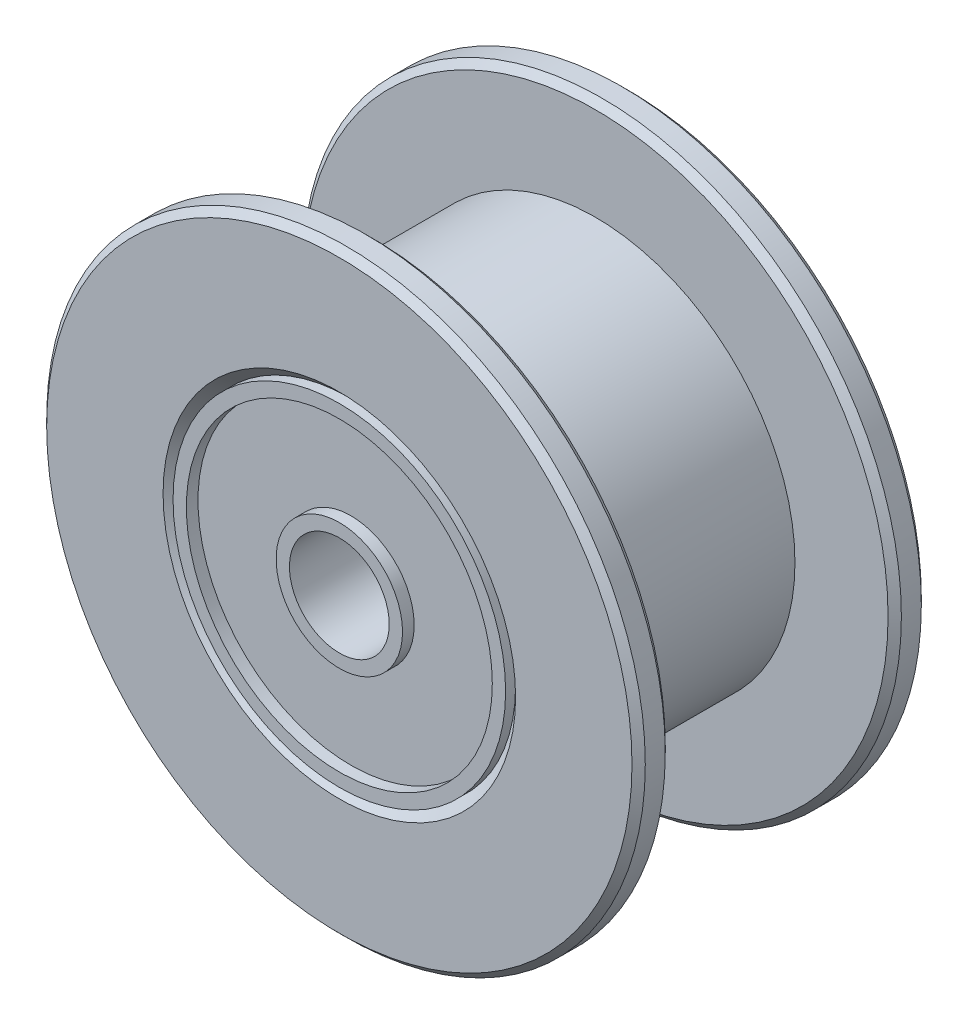
ISO-10303-21;
HEADER;
FILE_DESCRIPTION(('STEP AP214'),'2;1');
FILE_NAME('part.step','',(''),(''),'','','');
FILE_SCHEMA(('AUTOMOTIVE_DESIGN { 1 0 10303 214 1 1 1 1 }'));
ENDSEC;
DATA;
#1=APPLICATION_CONTEXT('core data for automotive mechanical design processes');
#2=APPLICATION_PROTOCOL_DEFINITION('international standard','automotive_design',2000,#1);
#3=PRODUCT_CONTEXT('',#1,'mechanical');
#4=PRODUCT('Part','Part','',(#3));
#5=PRODUCT_RELATED_PRODUCT_CATEGORY('part','',(#4));
#6=PRODUCT_DEFINITION_FORMATION('','',#4);
#7=PRODUCT_DEFINITION_CONTEXT('part definition',#1,'design');
#8=PRODUCT_DEFINITION('design','',#6,#7);
#9=PRODUCT_DEFINITION_SHAPE('','',#8);
#10=(LENGTH_UNIT() NAMED_UNIT(*) SI_UNIT(.MILLI.,.METRE.));
#11=(NAMED_UNIT(*) PLANE_ANGLE_UNIT() SI_UNIT($,.RADIAN.));
#12=(NAMED_UNIT(*) SI_UNIT($,.STERADIAN.) SOLID_ANGLE_UNIT());
#13=UNCERTAINTY_MEASURE_WITH_UNIT(LENGTH_MEASURE(1.E-05),#10,'distance_accuracy_value','');
#14=(GEOMETRIC_REPRESENTATION_CONTEXT(3) GLOBAL_UNCERTAINTY_ASSIGNED_CONTEXT((#13)) GLOBAL_UNIT_ASSIGNED_CONTEXT((#10,
#11,#12)) REPRESENTATION_CONTEXT('',''));
#15=CARTESIAN_POINT('',(0.,0.,0.));
#16=DIRECTION('',(0.,0.,1.));
#17=DIRECTION('',(1.,0.,0.));
#18=AXIS2_PLACEMENT_3D('',#15,#16,#17);
#19=CARTESIAN_POINT('',(5.,0.,-4.35));
#20=DIRECTION('',(0.,0.,-1.));
#21=DIRECTION('',(-1.,0.,0.));
#22=AXIS2_PLACEMENT_3D('',#19,#20,#21);
#23=PLANE('',#22);
#24=CARTESIAN_POINT('',(0.,0.,-4.35));
#25=DIRECTION('',(0.,0.,1.));
#26=DIRECTION('',(1.,0.,0.));
#27=AXIS2_PLACEMENT_3D('',#24,#25,#26);
#28=CIRCLE('',#27,4.6);
#29=CARTESIAN_POINT('',(4.6,0.,-4.35));
#30=VERTEX_POINT('',#29);
#31=EDGE_CURVE('E10',#30,#30,#28,.T.);
#32=ORIENTED_EDGE('',*,*,#31,.T.);
#33=EDGE_LOOP('',(#32));
#34=FACE_BOUND('',#33,.T.);
#35=CARTESIAN_POINT('',(0.,0.,-4.35));
#36=DIRECTION('',(0.,0.,1.));
#37=DIRECTION('',(1.,0.,0.));
#38=AXIS2_PLACEMENT_3D('',#35,#36,#37);
#39=CIRCLE('',#38,5.);
#40=CARTESIAN_POINT('',(5.,0.,-4.35));
#41=VERTEX_POINT('',#40);
#42=EDGE_CURVE('E117',#41,#41,#39,.T.);
#43=ORIENTED_EDGE('',*,*,#42,.F.);
#44=EDGE_LOOP('',(#43));
#45=FACE_BOUND('',#44,.T.);
#46=ADVANCED_FACE('F35',(#34,#45),#23,.T.);
#47=CARTESIAN_POINT('',(0.,0.,-4.35));
#48=DIRECTION('',(0.,0.,1.));
#49=DIRECTION('',(1.,0.,0.));
#50=AXIS2_PLACEMENT_3D('',#47,#48,#49);
#51=CYLINDRICAL_SURFACE('',#50,4.6);
#52=CARTESIAN_POINT('',(0.,0.,-4.));
#53=DIRECTION('',(0.,0.,1.));
#54=DIRECTION('',(1.,0.,0.));
#55=AXIS2_PLACEMENT_3D('',#52,#53,#54);
#56=CIRCLE('',#55,4.6);
#57=CARTESIAN_POINT('',(4.6,0.,-4.));
#58=VERTEX_POINT('',#57);
#59=EDGE_CURVE('E41',#58,#58,#56,.T.);
#60=ORIENTED_EDGE('',*,*,#59,.T.);
#61=EDGE_LOOP('',(#60));
#62=FACE_BOUND('',#61,.T.);
#63=ORIENTED_EDGE('',*,*,#31,.F.);
#64=EDGE_LOOP('',(#63));
#65=FACE_BOUND('',#64,.T.);
#66=ADVANCED_FACE('F125',(#62,#65),#51,.F.);
#67=CARTESIAN_POINT('',(4.6,0.,-4.));
#68=DIRECTION('',(0.,0.,-1.));
#69=DIRECTION('',(-1.,0.,0.));
#70=AXIS2_PLACEMENT_3D('',#67,#68,#69);
#71=PLANE('',#70);
#72=CARTESIAN_POINT('',(0.,0.,-4.));
#73=DIRECTION('',(0.,0.,1.));
#74=DIRECTION('',(1.,0.,0.));
#75=AXIS2_PLACEMENT_3D('',#72,#73,#74);
#76=CIRCLE('',#75,1.9);
#77=CARTESIAN_POINT('',(1.9,0.,-4.));
#78=VERTEX_POINT('',#77);
#79=EDGE_CURVE('E45',#78,#78,#76,.T.);
#80=ORIENTED_EDGE('',*,*,#79,.T.);
#81=EDGE_LOOP('',(#80));
#82=FACE_BOUND('',#81,.T.);
#83=ORIENTED_EDGE('',*,*,#59,.F.);
#84=EDGE_LOOP('',(#83));
#85=FACE_BOUND('',#84,.T.);
#86=ADVANCED_FACE('F129',(#82,#85),#71,.T.);
#87=CARTESIAN_POINT('',(0.,0.,-4.35));
#88=DIRECTION('',(0.,0.,1.));
#89=DIRECTION('',(1.,0.,0.));
#90=AXIS2_PLACEMENT_3D('',#87,#88,#89);
#91=CYLINDRICAL_SURFACE('',#90,1.9);
#92=CARTESIAN_POINT('',(0.,0.,-4.35));
#93=DIRECTION('',(0.,0.,1.));
#94=DIRECTION('',(1.,0.,0.));
#95=AXIS2_PLACEMENT_3D('',#92,#93,#94);
#96=CIRCLE('',#95,1.9);
#97=CARTESIAN_POINT('',(1.9,0.,-4.35));
#98=VERTEX_POINT('',#97);
#99=EDGE_CURVE('E49',#98,#98,#96,.T.);
#100=ORIENTED_EDGE('',*,*,#99,.T.);
#101=EDGE_LOOP('',(#100));
#102=FACE_BOUND('',#101,.T.);
#103=ORIENTED_EDGE('',*,*,#79,.F.);
#104=EDGE_LOOP('',(#103));
#105=FACE_BOUND('',#104,.T.);
#106=ADVANCED_FACE('F133',(#102,#105),#91,.T.);
#107=CARTESIAN_POINT('',(1.9,0.,-4.35));
#108=DIRECTION('',(0.,0.,-1.));
#109=DIRECTION('',(-1.,0.,0.));
#110=AXIS2_PLACEMENT_3D('',#107,#108,#109);
#111=PLANE('',#110);
#112=CARTESIAN_POINT('',(0.,0.,-4.35));
#113=DIRECTION('',(0.,0.,1.));
#114=DIRECTION('',(1.,0.,0.));
#115=AXIS2_PLACEMENT_3D('',#112,#113,#114);
#116=CIRCLE('',#115,1.5);
#117=CARTESIAN_POINT('',(1.5,0.,-4.35));
#118=VERTEX_POINT('',#117);
#119=EDGE_CURVE('E54',#118,#118,#116,.T.);
#120=ORIENTED_EDGE('',*,*,#119,.T.);
#121=EDGE_LOOP('',(#120));
#122=FACE_BOUND('',#121,.T.);
#123=ORIENTED_EDGE('',*,*,#99,.F.);
#124=EDGE_LOOP('',(#123));
#125=FACE_BOUND('',#124,.T.);
#126=ADVANCED_FACE('F140',(#122,#125),#111,.T.);
#127=CARTESIAN_POINT('',(0.,0.,-4.35));
#128=DIRECTION('',(0.,0.,1.));
#129=DIRECTION('',(1.,0.,0.));
#130=AXIS2_PLACEMENT_3D('',#127,#128,#129);
#131=CYLINDRICAL_SURFACE('',#130,1.5);
#132=CARTESIAN_POINT('',(0.,0.,4.35));
#133=DIRECTION('',(0.,0.,1.));
#134=DIRECTION('',(1.,0.,0.));
#135=AXIS2_PLACEMENT_3D('',#132,#133,#134);
#136=CIRCLE('',#135,1.5);
#137=CARTESIAN_POINT('',(1.5,0.,4.35));
#138=VERTEX_POINT('',#137);
#139=EDGE_CURVE('E57',#138,#138,#136,.T.);
#140=ORIENTED_EDGE('',*,*,#139,.T.);
#141=EDGE_LOOP('',(#140));
#142=FACE_BOUND('',#141,.T.);
#143=ORIENTED_EDGE('',*,*,#119,.F.);
#144=EDGE_LOOP('',(#143));
#145=FACE_BOUND('',#144,.T.);
#146=ADVANCED_FACE('F144',(#142,#145),#131,.F.);
#147=CARTESIAN_POINT('',(1.5,0.,4.35));
#148=DIRECTION('',(0.,0.,1.));
#149=DIRECTION('',(1.,0.,0.));
#150=AXIS2_PLACEMENT_3D('',#147,#148,#149);
#151=PLANE('',#150);
#152=CARTESIAN_POINT('',(0.,0.,4.35));
#153=DIRECTION('',(0.,0.,1.));
#154=DIRECTION('',(1.,0.,0.));
#155=AXIS2_PLACEMENT_3D('',#152,#153,#154);
#156=CIRCLE('',#155,1.9);
#157=CARTESIAN_POINT('',(1.9,0.,4.35));
#158=VERTEX_POINT('',#157);
#159=EDGE_CURVE('E60',#158,#158,#156,.T.);
#160=ORIENTED_EDGE('',*,*,#159,.T.);
#161=EDGE_LOOP('',(#160));
#162=FACE_BOUND('',#161,.T.);
#163=ORIENTED_EDGE('',*,*,#139,.F.);
#164=EDGE_LOOP('',(#163));
#165=FACE_BOUND('',#164,.T.);
#166=ADVANCED_FACE('F148',(#162,#165),#151,.T.);
#167=CARTESIAN_POINT('',(0.,0.,-4.35));
#168=DIRECTION('',(0.,0.,1.));
#169=DIRECTION('',(1.,0.,0.));
#170=AXIS2_PLACEMENT_3D('',#167,#168,#169);
#171=CYLINDRICAL_SURFACE('',#170,1.9);
#172=CARTESIAN_POINT('',(0.,0.,4.));
#173=DIRECTION('',(0.,0.,1.));
#174=DIRECTION('',(1.,0.,0.));
#175=AXIS2_PLACEMENT_3D('',#172,#173,#174);
#176=CIRCLE('',#175,1.9);
#177=CARTESIAN_POINT('',(1.9,0.,4.));
#178=VERTEX_POINT('',#177);
#179=EDGE_CURVE('E63',#178,#178,#176,.T.);
#180=ORIENTED_EDGE('',*,*,#179,.T.);
#181=EDGE_LOOP('',(#180));
#182=FACE_BOUND('',#181,.T.);
#183=ORIENTED_EDGE('',*,*,#159,.F.);
#184=EDGE_LOOP('',(#183));
#185=FACE_BOUND('',#184,.T.);
#186=ADVANCED_FACE('F152',(#182,#185),#171,.T.);
#187=CARTESIAN_POINT('',(1.9,0.,4.));
#188=DIRECTION('',(0.,0.,1.));
#189=DIRECTION('',(1.,0.,0.));
#190=AXIS2_PLACEMENT_3D('',#187,#188,#189);
#191=PLANE('',#190);
#192=CARTESIAN_POINT('',(0.,0.,4.));
#193=DIRECTION('',(0.,0.,1.));
#194=DIRECTION('',(1.,0.,0.));
#195=AXIS2_PLACEMENT_3D('',#192,#193,#194);
#196=CIRCLE('',#195,4.6);
#197=CARTESIAN_POINT('',(4.6,0.,4.));
#198=VERTEX_POINT('',#197);
#199=EDGE_CURVE('E66',#198,#198,#196,.T.);
#200=ORIENTED_EDGE('',*,*,#199,.T.);
#201=EDGE_LOOP('',(#200));
#202=FACE_BOUND('',#201,.T.);
#203=ORIENTED_EDGE('',*,*,#179,.F.);
#204=EDGE_LOOP('',(#203));
#205=FACE_BOUND('',#204,.T.);
#206=ADVANCED_FACE('F156',(#202,#205),#191,.T.);
#207=CARTESIAN_POINT('',(0.,0.,-4.35));
#208=DIRECTION('',(0.,0.,1.));
#209=DIRECTION('',(1.,0.,0.));
#210=AXIS2_PLACEMENT_3D('',#207,#208,#209);
#211=CYLINDRICAL_SURFACE('',#210,4.6);
#212=CARTESIAN_POINT('',(0.,0.,4.35));
#213=DIRECTION('',(0.,0.,1.));
#214=DIRECTION('',(1.,0.,0.));
#215=AXIS2_PLACEMENT_3D('',#212,#213,#214);
#216=CIRCLE('',#215,4.6);
#217=CARTESIAN_POINT('',(4.6,0.,4.35));
#218=VERTEX_POINT('',#217);
#219=EDGE_CURVE('E69',#218,#218,#216,.T.);
#220=ORIENTED_EDGE('',*,*,#219,.T.);
#221=EDGE_LOOP('',(#220));
#222=FACE_BOUND('',#221,.T.);
#223=ORIENTED_EDGE('',*,*,#199,.F.);
#224=EDGE_LOOP('',(#223));
#225=FACE_BOUND('',#224,.T.);
#226=ADVANCED_FACE('F160',(#222,#225),#211,.F.);
#227=CARTESIAN_POINT('',(4.6,0.,4.35));
#228=DIRECTION('',(0.,0.,1.));
#229=DIRECTION('',(1.,0.,0.));
#230=AXIS2_PLACEMENT_3D('',#227,#228,#229);
#231=PLANE('',#230);
#232=CARTESIAN_POINT('',(0.,0.,4.35));
#233=DIRECTION('',(0.,0.,1.));
#234=DIRECTION('',(1.,0.,0.));
#235=AXIS2_PLACEMENT_3D('',#232,#233,#234);
#236=CIRCLE('',#235,5.);
#237=CARTESIAN_POINT('',(5.,0.,4.35));
#238=VERTEX_POINT('',#237);
#239=EDGE_CURVE('E72',#238,#238,#236,.T.);
#240=ORIENTED_EDGE('',*,*,#239,.T.);
#241=EDGE_LOOP('',(#240));
#242=FACE_BOUND('',#241,.T.);
#243=ORIENTED_EDGE('',*,*,#219,.F.);
#244=EDGE_LOOP('',(#243));
#245=FACE_BOUND('',#244,.T.);
#246=ADVANCED_FACE('F164',(#242,#245),#231,.T.);
#247=CARTESIAN_POINT('',(0.,0.,-4.35));
#248=DIRECTION('',(0.,0.,1.));
#249=DIRECTION('',(1.,0.,0.));
#250=AXIS2_PLACEMENT_3D('',#247,#248,#249);
#251=CYLINDRICAL_SURFACE('',#250,5.);
#252=CARTESIAN_POINT('',(0.,0.,4.05));
#253=DIRECTION('',(0.,0.,1.));
#254=DIRECTION('',(1.,0.,0.));
#255=AXIS2_PLACEMENT_3D('',#252,#253,#254);
#256=CIRCLE('',#255,5.);
#257=CARTESIAN_POINT('',(5.,0.,4.05));
#258=VERTEX_POINT('',#257);
#259=EDGE_CURVE('E75',#258,#258,#256,.T.);
#260=ORIENTED_EDGE('',*,*,#259,.T.);
#261=EDGE_LOOP('',(#260));
#262=FACE_BOUND('',#261,.T.);
#263=ORIENTED_EDGE('',*,*,#239,.F.);
#264=EDGE_LOOP('',(#263));
#265=FACE_BOUND('',#264,.T.);
#266=ADVANCED_FACE('F168',(#262,#265),#251,.T.);
#267=CARTESIAN_POINT('',(0.,0.,4.05));
#268=DIRECTION('',(0.,0.,1.));
#269=DIRECTION('',(1.,0.,0.));
#270=AXIS2_PLACEMENT_3D('',#267,#268,#269);
#271=CONICAL_SURFACE('',#270,5.,0.785398163397448);
#272=CARTESIAN_POINT('',(0.,0.,4.35));
#273=DIRECTION('',(0.,0.,1.));
#274=DIRECTION('',(1.,0.,0.));
#275=AXIS2_PLACEMENT_3D('',#272,#273,#274);
#276=CIRCLE('',#275,5.3);
#277=CARTESIAN_POINT('',(5.3,0.,4.35));
#278=VERTEX_POINT('',#277);
#279=EDGE_CURVE('E78',#278,#278,#276,.T.);
#280=ORIENTED_EDGE('',*,*,#279,.T.);
#281=EDGE_LOOP('',(#280));
#282=FACE_BOUND('',#281,.T.);
#283=ORIENTED_EDGE('',*,*,#259,.F.);
#284=EDGE_LOOP('',(#283));
#285=FACE_BOUND('',#284,.T.);
#286=ADVANCED_FACE('F172',(#282,#285),#271,.F.);
#287=CARTESIAN_POINT('',(5.3,0.,4.35));
#288=DIRECTION('',(0.,0.,1.));
#289=DIRECTION('',(1.,0.,0.));
#290=AXIS2_PLACEMENT_3D('',#287,#288,#289);
#291=PLANE('',#290);
#292=CARTESIAN_POINT('',(0.,0.,4.35));
#293=DIRECTION('',(0.,0.,1.));
#294=DIRECTION('',(1.,0.,0.));
#295=AXIS2_PLACEMENT_3D('',#292,#293,#294);
#296=CIRCLE('',#295,8.8);
#297=CARTESIAN_POINT('',(8.8,0.,4.35));
#298=VERTEX_POINT('',#297);
#299=EDGE_CURVE('E81',#298,#298,#296,.T.);
#300=ORIENTED_EDGE('',*,*,#299,.T.);
#301=EDGE_LOOP('',(#300));
#302=FACE_BOUND('',#301,.T.);
#303=ORIENTED_EDGE('',*,*,#279,.F.);
#304=EDGE_LOOP('',(#303));
#305=FACE_BOUND('',#304,.T.);
#306=ADVANCED_FACE('F176',(#302,#305),#291,.T.);
#307=CARTESIAN_POINT('',(0.,0.,4.35));
#308=DIRECTION('',(0.,0.,-1.));
#309=DIRECTION('',(-1.,0.,0.));
#310=AXIS2_PLACEMENT_3D('',#307,#308,#309);
#311=CONICAL_SURFACE('',#310,8.8,0.785398163397422);
#312=CARTESIAN_POINT('',(0.,0.,4.15));
#313=DIRECTION('',(0.,0.,1.));
#314=DIRECTION('',(1.,0.,0.));
#315=AXIS2_PLACEMENT_3D('',#312,#313,#314);
#316=CIRCLE('',#315,8.99999999999999);
#317=CARTESIAN_POINT('',(8.99999999999999,0.,4.15));
#318=VERTEX_POINT('',#317);
#319=EDGE_CURVE('E84',#318,#318,#316,.T.);
#320=ORIENTED_EDGE('',*,*,#319,.T.);
#321=EDGE_LOOP('',(#320));
#322=FACE_BOUND('',#321,.T.);
#323=ORIENTED_EDGE('',*,*,#299,.F.);
#324=EDGE_LOOP('',(#323));
#325=FACE_BOUND('',#324,.T.);
#326=ADVANCED_FACE('F180',(#322,#325),#311,.T.);
#327=CARTESIAN_POINT('',(0.,0.,-4.35));
#328=DIRECTION('',(0.,0.,1.));
#329=DIRECTION('',(1.,0.,0.));
#330=AXIS2_PLACEMENT_3D('',#327,#328,#329);
#331=CYLINDRICAL_SURFACE('',#330,8.99999999999999);
#332=CARTESIAN_POINT('',(0.,0.,3.55));
#333=DIRECTION('',(0.,0.,1.));
#334=DIRECTION('',(1.,0.,0.));
#335=AXIS2_PLACEMENT_3D('',#332,#333,#334);
#336=CIRCLE('',#335,9.);
#337=CARTESIAN_POINT('',(9.,0.,3.55));
#338=VERTEX_POINT('',#337);
#339=EDGE_CURVE('E87',#338,#338,#336,.T.);
#340=ORIENTED_EDGE('',*,*,#339,.T.);
#341=EDGE_LOOP('',(#340));
#342=FACE_BOUND('',#341,.T.);
#343=ORIENTED_EDGE('',*,*,#319,.F.);
#344=EDGE_LOOP('',(#343));
#345=FACE_BOUND('',#344,.T.);
#346=ADVANCED_FACE('F184',(#342,#345),#331,.T.);
#347=CARTESIAN_POINT('',(0.,0.,3.55));
#348=DIRECTION('',(0.,0.,1.));
#349=DIRECTION('',(1.,0.,0.));
#350=AXIS2_PLACEMENT_3D('',#347,#348,#349);
#351=CONICAL_SURFACE('',#350,9.,0.785398163397444);
#352=CARTESIAN_POINT('',(0.,0.,3.35));
#353=DIRECTION('',(0.,0.,1.));
#354=DIRECTION('',(1.,0.,0.));
#355=AXIS2_PLACEMENT_3D('',#352,#353,#354);
#356=CIRCLE('',#355,8.8);
#357=CARTESIAN_POINT('',(8.8,0.,3.35));
#358=VERTEX_POINT('',#357);
#359=EDGE_CURVE('E90',#358,#358,#356,.T.);
#360=ORIENTED_EDGE('',*,*,#359,.T.);
#361=EDGE_LOOP('',(#360));
#362=FACE_BOUND('',#361,.T.);
#363=ORIENTED_EDGE('',*,*,#339,.F.);
#364=EDGE_LOOP('',(#363));
#365=FACE_BOUND('',#364,.T.);
#366=ADVANCED_FACE('F188',(#362,#365),#351,.T.);
#367=CARTESIAN_POINT('',(8.8,0.,3.35));
#368=DIRECTION('',(0.,0.,-1.));
#369=DIRECTION('',(-1.,0.,0.));
#370=AXIS2_PLACEMENT_3D('',#367,#368,#369);
#371=PLANE('',#370);
#372=CARTESIAN_POINT('',(0.,0.,3.35));
#373=DIRECTION('',(0.,0.,1.));
#374=DIRECTION('',(1.,0.,0.));
#375=AXIS2_PLACEMENT_3D('',#372,#373,#374);
#376=CIRCLE('',#375,6.);
#377=CARTESIAN_POINT('',(6.,0.,3.35));
#378=VERTEX_POINT('',#377);
#379=EDGE_CURVE('E93',#378,#378,#376,.T.);
#380=ORIENTED_EDGE('',*,*,#379,.T.);
#381=EDGE_LOOP('',(#380));
#382=FACE_BOUND('',#381,.T.);
#383=ORIENTED_EDGE('',*,*,#359,.F.);
#384=EDGE_LOOP('',(#383));
#385=FACE_BOUND('',#384,.T.);
#386=ADVANCED_FACE('F192',(#382,#385),#371,.T.);
#387=CARTESIAN_POINT('',(0.,0.,-4.35));
#388=DIRECTION('',(0.,0.,1.));
#389=DIRECTION('',(1.,0.,0.));
#390=AXIS2_PLACEMENT_3D('',#387,#388,#389);
#391=CYLINDRICAL_SURFACE('',#390,6.);
#392=CARTESIAN_POINT('',(0.,0.,-3.35));
#393=DIRECTION('',(0.,0.,1.));
#394=DIRECTION('',(1.,0.,0.));
#395=AXIS2_PLACEMENT_3D('',#392,#393,#394);
#396=CIRCLE('',#395,6.);
#397=CARTESIAN_POINT('',(6.,0.,-3.35));
#398=VERTEX_POINT('',#397);
#399=EDGE_CURVE('E96',#398,#398,#396,.T.);
#400=ORIENTED_EDGE('',*,*,#399,.T.);
#401=EDGE_LOOP('',(#400));
#402=FACE_BOUND('',#401,.T.);
#403=ORIENTED_EDGE('',*,*,#379,.F.);
#404=EDGE_LOOP('',(#403));
#405=FACE_BOUND('',#404,.T.);
#406=ADVANCED_FACE('F196',(#402,#405),#391,.T.);
#407=CARTESIAN_POINT('',(6.,0.,-3.35));
#408=DIRECTION('',(0.,0.,1.));
#409=DIRECTION('',(1.,0.,0.));
#410=AXIS2_PLACEMENT_3D('',#407,#408,#409);
#411=PLANE('',#410);
#412=CARTESIAN_POINT('',(0.,0.,-3.35));
#413=DIRECTION('',(0.,0.,1.));
#414=DIRECTION('',(1.,0.,0.));
#415=AXIS2_PLACEMENT_3D('',#412,#413,#414);
#416=CIRCLE('',#415,8.8);
#417=CARTESIAN_POINT('',(8.8,0.,-3.35));
#418=VERTEX_POINT('',#417);
#419=EDGE_CURVE('E99',#418,#418,#416,.T.);
#420=ORIENTED_EDGE('',*,*,#419,.T.);
#421=EDGE_LOOP('',(#420));
#422=FACE_BOUND('',#421,.T.);
#423=ORIENTED_EDGE('',*,*,#399,.F.);
#424=EDGE_LOOP('',(#423));
#425=FACE_BOUND('',#424,.T.);
#426=ADVANCED_FACE('F200',(#422,#425),#411,.T.);
#427=CARTESIAN_POINT('',(0.,0.,-3.35));
#428=DIRECTION('',(0.,0.,-1.));
#429=DIRECTION('',(-1.,0.,0.));
#430=AXIS2_PLACEMENT_3D('',#427,#428,#429);
#431=CONICAL_SURFACE('',#430,8.8,0.785398163397419);
#432=CARTESIAN_POINT('',(0.,0.,-3.55));
#433=DIRECTION('',(0.,0.,1.));
#434=DIRECTION('',(1.,0.,0.));
#435=AXIS2_PLACEMENT_3D('',#432,#433,#434);
#436=CIRCLE('',#435,8.99999999999999);
#437=CARTESIAN_POINT('',(8.99999999999999,0.,-3.55));
#438=VERTEX_POINT('',#437);
#439=EDGE_CURVE('E102',#438,#438,#436,.T.);
#440=ORIENTED_EDGE('',*,*,#439,.T.);
#441=EDGE_LOOP('',(#440));
#442=FACE_BOUND('',#441,.T.);
#443=ORIENTED_EDGE('',*,*,#419,.F.);
#444=EDGE_LOOP('',(#443));
#445=FACE_BOUND('',#444,.T.);
#446=ADVANCED_FACE('F204',(#442,#445),#431,.T.);
#447=CARTESIAN_POINT('',(0.,0.,-4.35));
#448=DIRECTION('',(0.,0.,1.));
#449=DIRECTION('',(1.,0.,0.));
#450=AXIS2_PLACEMENT_3D('',#447,#448,#449);
#451=CYLINDRICAL_SURFACE('',#450,8.99999999999999);
#452=CARTESIAN_POINT('',(0.,0.,-4.15));
#453=DIRECTION('',(0.,0.,1.));
#454=DIRECTION('',(1.,0.,0.));
#455=AXIS2_PLACEMENT_3D('',#452,#453,#454);
#456=CIRCLE('',#455,9.);
#457=CARTESIAN_POINT('',(9.,0.,-4.15));
#458=VERTEX_POINT('',#457);
#459=EDGE_CURVE('E105',#458,#458,#456,.T.);
#460=ORIENTED_EDGE('',*,*,#459,.T.);
#461=EDGE_LOOP('',(#460));
#462=FACE_BOUND('',#461,.T.);
#463=ORIENTED_EDGE('',*,*,#439,.F.);
#464=EDGE_LOOP('',(#463));
#465=FACE_BOUND('',#464,.T.);
#466=ADVANCED_FACE('F208',(#462,#465),#451,.T.);
#467=CARTESIAN_POINT('',(0.,0.,-4.15));
#468=DIRECTION('',(0.,0.,1.));
#469=DIRECTION('',(1.,0.,0.));
#470=AXIS2_PLACEMENT_3D('',#467,#468,#469);
#471=CONICAL_SURFACE('',#470,9.,0.785398163397446);
#472=CARTESIAN_POINT('',(0.,0.,-4.35));
#473=DIRECTION('',(0.,0.,1.));
#474=DIRECTION('',(1.,0.,0.));
#475=AXIS2_PLACEMENT_3D('',#472,#473,#474);
#476=CIRCLE('',#475,8.8);
#477=CARTESIAN_POINT('',(8.8,0.,-4.35));
#478=VERTEX_POINT('',#477);
#479=EDGE_CURVE('E108',#478,#478,#476,.T.);
#480=ORIENTED_EDGE('',*,*,#479,.T.);
#481=EDGE_LOOP('',(#480));
#482=FACE_BOUND('',#481,.T.);
#483=ORIENTED_EDGE('',*,*,#459,.F.);
#484=EDGE_LOOP('',(#483));
#485=FACE_BOUND('',#484,.T.);
#486=ADVANCED_FACE('F212',(#482,#485),#471,.T.);
#487=CARTESIAN_POINT('',(8.8,0.,-4.35));
#488=DIRECTION('',(0.,0.,-1.));
#489=DIRECTION('',(-1.,0.,0.));
#490=AXIS2_PLACEMENT_3D('',#487,#488,#489);
#491=PLANE('',#490);
#492=CARTESIAN_POINT('',(0.,0.,-4.35));
#493=DIRECTION('',(0.,0.,1.));
#494=DIRECTION('',(1.,0.,0.));
#495=AXIS2_PLACEMENT_3D('',#492,#493,#494);
#496=CIRCLE('',#495,5.3);
#497=CARTESIAN_POINT('',(5.3,0.,-4.35));
#498=VERTEX_POINT('',#497);
#499=EDGE_CURVE('E111',#498,#498,#496,.T.);
#500=ORIENTED_EDGE('',*,*,#499,.T.);
#501=EDGE_LOOP('',(#500));
#502=FACE_BOUND('',#501,.T.);
#503=ORIENTED_EDGE('',*,*,#479,.F.);
#504=EDGE_LOOP('',(#503));
#505=FACE_BOUND('',#504,.T.);
#506=ADVANCED_FACE('F216',(#502,#505),#491,.T.);
#507=CARTESIAN_POINT('',(0.,0.,-4.35));
#508=DIRECTION('',(0.,0.,-1.));
#509=DIRECTION('',(-1.,0.,0.));
#510=AXIS2_PLACEMENT_3D('',#507,#508,#509);
#511=CONICAL_SURFACE('',#510,5.3,0.78539816339745);
#512=CARTESIAN_POINT('',(0.,0.,-4.05));
#513=DIRECTION('',(0.,0.,1.));
#514=DIRECTION('',(1.,0.,0.));
#515=AXIS2_PLACEMENT_3D('',#512,#513,#514);
#516=CIRCLE('',#515,5.);
#517=CARTESIAN_POINT('',(5.,0.,-4.05));
#518=VERTEX_POINT('',#517);
#519=EDGE_CURVE('E114',#518,#518,#516,.T.);
#520=ORIENTED_EDGE('',*,*,#519,.T.);
#521=EDGE_LOOP('',(#520));
#522=FACE_BOUND('',#521,.T.);
#523=ORIENTED_EDGE('',*,*,#499,.F.);
#524=EDGE_LOOP('',(#523));
#525=FACE_BOUND('',#524,.T.);
#526=ADVANCED_FACE('F220',(#522,#525),#511,.F.);
#527=CARTESIAN_POINT('',(0.,0.,-4.35));
#528=DIRECTION('',(0.,0.,1.));
#529=DIRECTION('',(1.,0.,0.));
#530=AXIS2_PLACEMENT_3D('',#527,#528,#529);
#531=CYLINDRICAL_SURFACE('',#530,5.);
#532=ORIENTED_EDGE('',*,*,#42,.T.);
#533=EDGE_LOOP('',(#532));
#534=FACE_BOUND('',#533,.T.);
#535=ORIENTED_EDGE('',*,*,#519,.F.);
#536=EDGE_LOOP('',(#535));
#537=FACE_BOUND('',#536,.T.);
#538=ADVANCED_FACE('F121',(#534,#537),#531,.T.);
#539=CLOSED_SHELL('',(#46,#66,#86,#106,#126,#146,#166,#186,#206,#226,#246,#266,#286,#306,#326,
#346,#366,#386,#406,#426,#446,#466,#486,#506,#526,#538));
#540=MANIFOLD_SOLID_BREP('B2',#539);
#541=ADVANCED_BREP_SHAPE_REPRESENTATION('',(#18,#540),#14);
#542=SHAPE_DEFINITION_REPRESENTATION(#9,#541);
ENDSEC;
END-ISO-10303-21;
